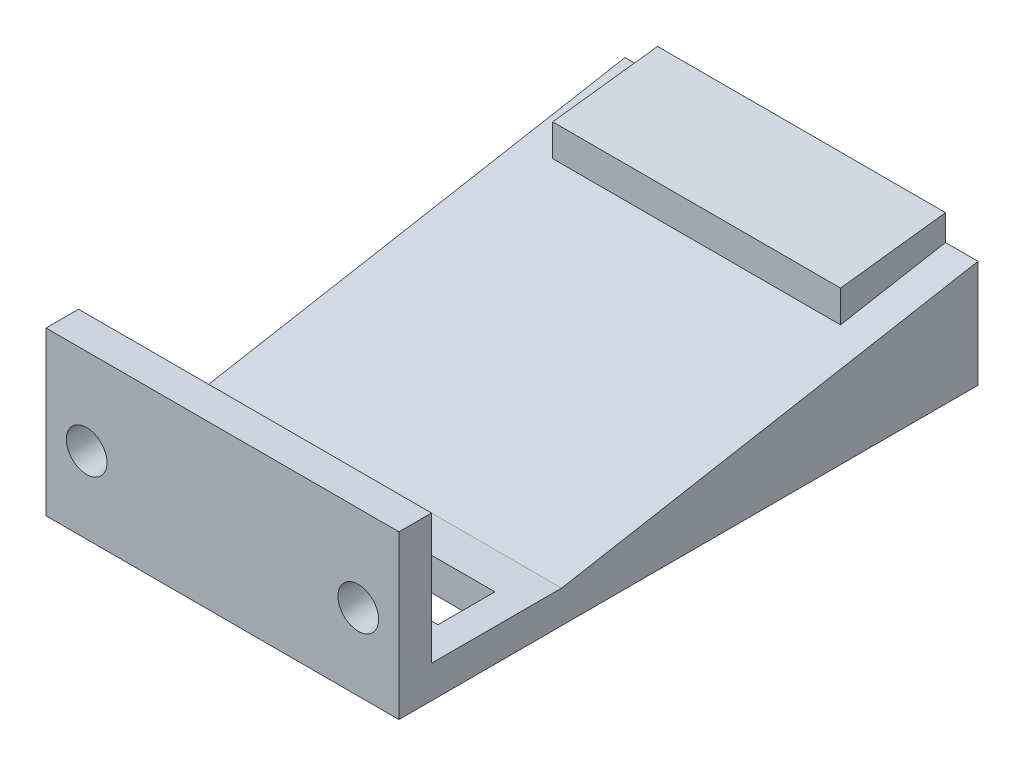
ISO-10303-21;
HEADER;
FILE_DESCRIPTION(('STEP AP214'),'2;1');
FILE_NAME('part.step','',(''),(''),'','','');
FILE_SCHEMA(('AUTOMOTIVE_DESIGN { 1 0 10303 214 1 1 1 1 }'));
ENDSEC;
DATA;
#1=APPLICATION_CONTEXT('core data for automotive mechanical design processes');
#2=APPLICATION_PROTOCOL_DEFINITION('international standard','automotive_design',2000,#1);
#3=PRODUCT_CONTEXT('',#1,'mechanical');
#4=PRODUCT('Part','Part','',(#3));
#5=PRODUCT_RELATED_PRODUCT_CATEGORY('part','',(#4));
#6=PRODUCT_DEFINITION_FORMATION('','',#4);
#7=PRODUCT_DEFINITION_CONTEXT('part definition',#1,'design');
#8=PRODUCT_DEFINITION('design','',#6,#7);
#9=PRODUCT_DEFINITION_SHAPE('','',#8);
#10=(LENGTH_UNIT() NAMED_UNIT(*) SI_UNIT(.MILLI.,.METRE.));
#11=(NAMED_UNIT(*) PLANE_ANGLE_UNIT() SI_UNIT($,.RADIAN.));
#12=(NAMED_UNIT(*) SI_UNIT($,.STERADIAN.) SOLID_ANGLE_UNIT());
#13=UNCERTAINTY_MEASURE_WITH_UNIT(LENGTH_MEASURE(1.E-05),#10,'distance_accuracy_value','');
#14=(GEOMETRIC_REPRESENTATION_CONTEXT(3) GLOBAL_UNCERTAINTY_ASSIGNED_CONTEXT((#13)) GLOBAL_UNIT_ASSIGNED_CONTEXT((#10,
#11,#12)) REPRESENTATION_CONTEXT('',''));
#15=CARTESIAN_POINT('',(0.,0.,0.));
#16=DIRECTION('',(0.,0.,1.));
#17=DIRECTION('',(1.,0.,0.));
#18=AXIS2_PLACEMENT_3D('',#15,#16,#17);
#19=CARTESIAN_POINT('',(10.85,3.,-16.8));
#20=DIRECTION('',(-1.,0.,0.));
#21=DIRECTION('',(0.,0.,1.));
#22=AXIS2_PLACEMENT_3D('',#19,#20,#21);
#23=PLANE('',#22);
#24=DIRECTION('',(0.,0.,1.));
#25=VECTOR('',#24,1.);
#26=CARTESIAN_POINT('',(10.85,1.,-16.8));
#27=LINE('',#26,#25);
#28=CARTESIAN_POINT('',(10.85,1.,-16.8));
#29=VERTEX_POINT('',#28);
#30=CARTESIAN_POINT('',(10.85,1.,18.8));
#31=VERTEX_POINT('',#30);
#32=EDGE_CURVE('E57',#29,#31,#27,.T.);
#33=ORIENTED_EDGE('',*,*,#32,.F.);
#34=DIRECTION('',(0.,-1.,0.));
#35=VECTOR('',#34,1.);
#36=CARTESIAN_POINT('',(10.85,3.,-16.8));
#37=LINE('',#36,#35);
#38=CARTESIAN_POINT('',(10.85,7.6,-16.8));
#39=VERTEX_POINT('',#38);
#40=EDGE_CURVE('E236',#39,#29,#37,.T.);
#41=ORIENTED_EDGE('',*,*,#40,.F.);
#42=DIRECTION('',(0.,-0.176855068818729,0.984236904730321));
#43=VECTOR('',#42,1.);
#44=CARTESIAN_POINT('',(10.85,3.,8.8));
#45=LINE('',#44,#43);
#46=CARTESIAN_POINT('',(10.85,3.,8.8));
#47=VERTEX_POINT('',#46);
#48=EDGE_CURVE('E187',#39,#47,#45,.T.);
#49=ORIENTED_EDGE('',*,*,#48,.T.);
#50=DIRECTION('',(0.,0.,-1.));
#51=VECTOR('',#50,1.);
#52=CARTESIAN_POINT('',(10.85,3.,-16.8));
#53=LINE('',#52,#51);
#54=CARTESIAN_POINT('',(10.85,3.,16.8));
#55=VERTEX_POINT('',#54);
#56=EDGE_CURVE('E221',#55,#47,#53,.T.);
#57=ORIENTED_EDGE('',*,*,#56,.F.);
#58=DIRECTION('',(0.,-1.,0.));
#59=VECTOR('',#58,1.);
#60=CARTESIAN_POINT('',(10.85,11.,16.8));
#61=LINE('',#60,#59);
#62=CARTESIAN_POINT('',(10.85,11.,16.8));
#63=VERTEX_POINT('',#62);
#64=EDGE_CURVE('E173',#63,#55,#61,.T.);
#65=ORIENTED_EDGE('',*,*,#64,.F.);
#66=DIRECTION('',(0.,0.,-1.));
#67=VECTOR('',#66,1.);
#68=CARTESIAN_POINT('',(10.85,11.,16.8));
#69=LINE('',#68,#67);
#70=CARTESIAN_POINT('',(10.85,11.,18.8));
#71=VERTEX_POINT('',#70);
#72=EDGE_CURVE('E298',#71,#63,#69,.T.);
#73=ORIENTED_EDGE('',*,*,#72,.F.);
#74=DIRECTION('',(0.,-1.,0.));
#75=VECTOR('',#74,1.);
#76=CARTESIAN_POINT('',(10.85,11.,18.8));
#77=LINE('',#76,#75);
#78=EDGE_CURVE('E170',#71,#31,#77,.T.);
#79=ORIENTED_EDGE('',*,*,#78,.T.);
#80=EDGE_LOOP('',(#33,#41,#49,#57,#65,#73,#79));
#81=FACE_BOUND('',#80,.T.);
#82=ADVANCED_FACE('F41',(#81),#23,.F.);
#83=CARTESIAN_POINT('',(-10.85,3.,-16.8));
#84=DIRECTION('',(0.,0.,1.));
#85=DIRECTION('',(1.,0.,0.));
#86=AXIS2_PLACEMENT_3D('',#83,#84,#85);
#87=PLANE('',#86);
#88=DIRECTION('',(1.,0.,0.));
#89=VECTOR('',#88,1.);
#90=CARTESIAN_POINT('',(-10.85,1.,-16.8));
#91=LINE('',#90,#89);
#92=CARTESIAN_POINT('',(-10.85,1.,-16.8));
#93=VERTEX_POINT('',#92);
#94=EDGE_CURVE('E165',#93,#29,#91,.T.);
#95=ORIENTED_EDGE('',*,*,#94,.F.);
#96=DIRECTION('',(0.,-1.,0.));
#97=VECTOR('',#96,1.);
#98=CARTESIAN_POINT('',(-10.85,3.,-16.8));
#99=LINE('',#98,#97);
#100=CARTESIAN_POINT('',(-10.85,7.6,-16.8));
#101=VERTEX_POINT('',#100);
#102=EDGE_CURVE('E164',#101,#93,#99,.T.);
#103=ORIENTED_EDGE('',*,*,#102,.F.);
#104=DIRECTION('',(1.,0.,0.));
#105=VECTOR('',#104,1.);
#106=CARTESIAN_POINT('',(-36.8599980776624,7.6,-16.8));
#107=LINE('',#106,#105);
#108=CARTESIAN_POINT('',(-8.85,7.6,-16.8));
#109=VERTEX_POINT('',#108);
#110=EDGE_CURVE('E197',#101,#109,#107,.T.);
#111=ORIENTED_EDGE('',*,*,#110,.T.);
#112=DIRECTION('',(0.,-1.,0.));
#113=VECTOR('',#112,1.);
#114=CARTESIAN_POINT('',(-8.85,9.2,-16.8));
#115=LINE('',#114,#113);
#116=CARTESIAN_POINT('',(-8.85,9.19196041782367,-16.8));
#117=VERTEX_POINT('',#116);
#118=EDGE_CURVE('E183',#117,#109,#115,.T.);
#119=ORIENTED_EDGE('',*,*,#118,.F.);
#120=DIRECTION('',(1.,0.,0.));
#121=VECTOR('',#120,1.);
#122=CARTESIAN_POINT('',(0.,9.19196041782367,-16.8));
#123=LINE('',#122,#121);
#124=CARTESIAN_POINT('',(8.85,9.19196041782367,-16.8));
#125=VERTEX_POINT('',#124);
#126=EDGE_CURVE('E248',#117,#125,#123,.T.);
#127=ORIENTED_EDGE('',*,*,#126,.T.);
#128=DIRECTION('',(0.,-1.,0.));
#129=VECTOR('',#128,1.);
#130=CARTESIAN_POINT('',(8.85,9.2,-16.8));
#131=LINE('',#130,#129);
#132=CARTESIAN_POINT('',(8.85,7.6,-16.8));
#133=VERTEX_POINT('',#132);
#134=EDGE_CURVE('E185',#125,#133,#131,.T.);
#135=ORIENTED_EDGE('',*,*,#134,.T.);
#136=EDGE_CURVE('E194',#133,#39,#107,.T.);
#137=ORIENTED_EDGE('',*,*,#136,.T.);
#138=ORIENTED_EDGE('',*,*,#40,.T.);
#139=EDGE_LOOP('',(#95,#103,#111,#119,#127,#135,#137,#138));
#140=FACE_BOUND('',#139,.T.);
#141=ADVANCED_FACE('F271',(#140),#87,.F.);
#142=CARTESIAN_POINT('',(-10.85,3.,-16.8));
#143=DIRECTION('',(1.,0.,0.));
#144=DIRECTION('',(0.,0.,-1.));
#145=AXIS2_PLACEMENT_3D('',#142,#143,#144);
#146=PLANE('',#145);
#147=DIRECTION('',(0.,0.,-1.));
#148=VECTOR('',#147,1.);
#149=CARTESIAN_POINT('',(-10.85,1.,18.8));
#150=LINE('',#149,#148);
#151=CARTESIAN_POINT('',(-10.85,1.,18.8));
#152=VERTEX_POINT('',#151);
#153=EDGE_CURVE('E149',#152,#93,#150,.T.);
#154=ORIENTED_EDGE('',*,*,#153,.F.);
#155=DIRECTION('',(0.,-1.,0.));
#156=VECTOR('',#155,1.);
#157=CARTESIAN_POINT('',(-10.85,11.,18.8));
#158=LINE('',#157,#156);
#159=CARTESIAN_POINT('',(-10.85,11.,18.8));
#160=VERTEX_POINT('',#159);
#161=EDGE_CURVE('E161',#160,#152,#158,.T.);
#162=ORIENTED_EDGE('',*,*,#161,.F.);
#163=DIRECTION('',(0.,0.,1.));
#164=VECTOR('',#163,1.);
#165=CARTESIAN_POINT('',(-10.85,11.,16.8));
#166=LINE('',#165,#164);
#167=CARTESIAN_POINT('',(-10.85,11.,16.8));
#168=VERTEX_POINT('',#167);
#169=EDGE_CURVE('E303',#168,#160,#166,.T.);
#170=ORIENTED_EDGE('',*,*,#169,.F.);
#171=DIRECTION('',(0.,-1.,0.));
#172=VECTOR('',#171,1.);
#173=CARTESIAN_POINT('',(-10.85,11.,16.8));
#174=LINE('',#173,#172);
#175=CARTESIAN_POINT('',(-10.85,3.,16.8));
#176=VERTEX_POINT('',#175);
#177=EDGE_CURVE('E169',#168,#176,#174,.T.);
#178=ORIENTED_EDGE('',*,*,#177,.T.);
#179=DIRECTION('',(0.,0.,1.));
#180=VECTOR('',#179,1.);
#181=CARTESIAN_POINT('',(-10.85,3.,-16.8));
#182=LINE('',#181,#180);
#183=CARTESIAN_POINT('',(-10.85,3.,8.8));
#184=VERTEX_POINT('',#183);
#185=EDGE_CURVE('E229',#184,#176,#182,.T.);
#186=ORIENTED_EDGE('',*,*,#185,.F.);
#187=DIRECTION('',(0.,0.176855068818729,-0.984236904730321));
#188=VECTOR('',#187,1.);
#189=CARTESIAN_POINT('',(-10.85,3.,8.8));
#190=LINE('',#189,#188);
#191=EDGE_CURVE('E188',#184,#101,#190,.T.);
#192=ORIENTED_EDGE('',*,*,#191,.T.);
#193=ORIENTED_EDGE('',*,*,#102,.T.);
#194=EDGE_LOOP('',(#154,#162,#170,#178,#186,#192,#193));
#195=FACE_BOUND('',#194,.T.);
#196=ADVANCED_FACE('F159',(#195),#146,.F.);
#197=CARTESIAN_POINT('',(-10.85,11.,18.8));
#198=DIRECTION('',(0.,0.,-1.));
#199=DIRECTION('',(-1.,0.,0.));
#200=AXIS2_PLACEMENT_3D('',#197,#198,#199);
#201=PLANE('',#200);
#202=CARTESIAN_POINT('',(8.35,5.7,18.8));
#203=DIRECTION('',(0.,0.,1.));
#204=DIRECTION('',(1.,0.,0.));
#205=AXIS2_PLACEMENT_3D('',#202,#203,#204);
#206=CIRCLE('',#205,1.25);
#207=CARTESIAN_POINT('',(9.6,5.7,18.8));
#208=VERTEX_POINT('',#207);
#209=EDGE_CURVE('E292',#208,#208,#206,.T.);
#210=ORIENTED_EDGE('',*,*,#209,.F.);
#211=EDGE_LOOP('',(#210));
#212=FACE_BOUND('',#211,.T.);
#213=CARTESIAN_POINT('',(-8.35,5.7,18.8));
#214=DIRECTION('',(0.,0.,1.));
#215=DIRECTION('',(1.,0.,0.));
#216=AXIS2_PLACEMENT_3D('',#213,#214,#215);
#217=CIRCLE('',#216,1.25);
#218=CARTESIAN_POINT('',(-7.10000000000001,5.7,18.8));
#219=VERTEX_POINT('',#218);
#220=EDGE_CURVE('E284',#219,#219,#217,.T.);
#221=ORIENTED_EDGE('',*,*,#220,.F.);
#222=EDGE_LOOP('',(#221));
#223=FACE_BOUND('',#222,.T.);
#224=DIRECTION('',(-1.,0.,0.));
#225=VECTOR('',#224,1.);
#226=CARTESIAN_POINT('',(10.85,1.,18.8));
#227=LINE('',#226,#225);
#228=EDGE_CURVE('E145',#31,#152,#227,.T.);
#229=ORIENTED_EDGE('',*,*,#228,.F.);
#230=ORIENTED_EDGE('',*,*,#78,.F.);
#231=DIRECTION('',(1.,0.,0.));
#232=VECTOR('',#231,1.);
#233=CARTESIAN_POINT('',(-10.85,11.,18.8));
#234=LINE('',#233,#232);
#235=EDGE_CURVE('E168',#160,#71,#234,.T.);
#236=ORIENTED_EDGE('',*,*,#235,.F.);
#237=ORIENTED_EDGE('',*,*,#161,.T.);
#238=EDGE_LOOP('',(#229,#230,#236,#237));
#239=FACE_BOUND('',#238,.T.);
#240=ADVANCED_FACE('F167',(#212,#223,#239),#201,.F.);
#241=CARTESIAN_POINT('',(-36.8599980776624,3.,8.80000000000001));
#242=DIRECTION('',(0.,0.984236904730321,0.176855068818729));
#243=DIRECTION('',(0.,-0.176855068818729,0.984236904730321));
#244=AXIS2_PLACEMENT_3D('',#241,#242,#243);
#245=PLANE('',#244);
#246=ORIENTED_EDGE('',*,*,#136,.F.);
#247=DIRECTION('',(0.,-0.176855068818729,0.984236904730321));
#248=VECTOR('',#247,1.);
#249=CARTESIAN_POINT('',(8.85,3.,8.8));
#250=LINE('',#249,#248);
#251=CARTESIAN_POINT('',(8.85,6.441015625,-10.35));
#252=VERTEX_POINT('',#251);
#253=EDGE_CURVE('E245',#133,#252,#250,.T.);
#254=ORIENTED_EDGE('',*,*,#253,.T.);
#255=DIRECTION('',(-1.,0.,0.));
#256=VECTOR('',#255,1.);
#257=CARTESIAN_POINT('',(-36.8599980776624,6.441015625,-10.35));
#258=LINE('',#257,#256);
#259=CARTESIAN_POINT('',(-8.85,6.441015625,-10.35));
#260=VERTEX_POINT('',#259);
#261=EDGE_CURVE('E239',#252,#260,#258,.T.);
#262=ORIENTED_EDGE('',*,*,#261,.T.);
#263=DIRECTION('',(0.,0.176855068818729,-0.984236904730321));
#264=VECTOR('',#263,1.);
#265=CARTESIAN_POINT('',(-8.85,3.,8.80000000000001));
#266=LINE('',#265,#264);
#267=EDGE_CURVE('E242',#260,#109,#266,.T.);
#268=ORIENTED_EDGE('',*,*,#267,.T.);
#269=ORIENTED_EDGE('',*,*,#110,.F.);
#270=ORIENTED_EDGE('',*,*,#191,.F.);
#271=DIRECTION('',(1.,0.,0.));
#272=VECTOR('',#271,1.);
#273=CARTESIAN_POINT('',(-36.8599980776624,3.,8.80000000000001));
#274=LINE('',#273,#272);
#275=EDGE_CURVE('E191',#184,#47,#274,.T.);
#276=ORIENTED_EDGE('',*,*,#275,.T.);
#277=ORIENTED_EDGE('',*,*,#48,.F.);
#278=EDGE_LOOP('',(#246,#254,#262,#268,#269,#270,#276,#277));
#279=FACE_BOUND('',#278,.T.);
#280=ADVANCED_FACE('F264',(#279),#245,.T.);
#281=CARTESIAN_POINT('',(0.,3.,0.));
#282=DIRECTION('',(0.,1.,0.));
#283=DIRECTION('',(0.,0.,1.));
#284=AXIS2_PLACEMENT_3D('',#281,#282,#283);
#285=PLANE('',#284);
#286=ORIENTED_EDGE('',*,*,#275,.F.);
#287=ORIENTED_EDGE('',*,*,#185,.T.);
#288=DIRECTION('',(1.,0.,0.));
#289=VECTOR('',#288,1.);
#290=CARTESIAN_POINT('',(-10.85,3.,16.8));
#291=LINE('',#290,#289);
#292=EDGE_CURVE('E232',#176,#55,#291,.T.);
#293=ORIENTED_EDGE('',*,*,#292,.T.);
#294=ORIENTED_EDGE('',*,*,#56,.T.);
#295=EDGE_LOOP('',(#286,#287,#293,#294));
#296=FACE_BOUND('',#295,.T.);
#297=DIRECTION('',(0.,0.,-1.));
#298=VECTOR('',#297,1.);
#299=CARTESIAN_POINT('',(9.,3.,11.05));
#300=LINE('',#299,#298);
#301=CARTESIAN_POINT('',(9.,3.,14.55));
#302=VERTEX_POINT('',#301);
#303=CARTESIAN_POINT('',(9.,3.,11.05));
#304=VERTEX_POINT('',#303);
#305=EDGE_CURVE('E190',#302,#304,#300,.T.);
#306=ORIENTED_EDGE('',*,*,#305,.F.);
#307=DIRECTION('',(1.,0.,0.));
#308=VECTOR('',#307,1.);
#309=CARTESIAN_POINT('',(-9.,3.,14.55));
#310=LINE('',#309,#308);
#311=CARTESIAN_POINT('',(-9.,3.,14.55));
#312=VERTEX_POINT('',#311);
#313=EDGE_CURVE('E203',#312,#302,#310,.T.);
#314=ORIENTED_EDGE('',*,*,#313,.F.);
#315=DIRECTION('',(0.,0.,1.));
#316=VECTOR('',#315,1.);
#317=CARTESIAN_POINT('',(-9.,3.,11.05));
#318=LINE('',#317,#316);
#319=CARTESIAN_POINT('',(-9.,3.,11.05));
#320=VERTEX_POINT('',#319);
#321=EDGE_CURVE('E214',#320,#312,#318,.T.);
#322=ORIENTED_EDGE('',*,*,#321,.F.);
#323=DIRECTION('',(-1.,0.,0.));
#324=VECTOR('',#323,1.);
#325=CARTESIAN_POINT('',(-9.,3.,11.05));
#326=LINE('',#325,#324);
#327=EDGE_CURVE('E211',#304,#320,#326,.T.);
#328=ORIENTED_EDGE('',*,*,#327,.F.);
#329=EDGE_LOOP('',(#306,#314,#322,#328));
#330=FACE_BOUND('',#329,.T.);
#331=ADVANCED_FACE('F276',(#296,#330),#285,.T.);
#332=CARTESIAN_POINT('',(9.,1.,11.05));
#333=DIRECTION('',(1.,0.,0.));
#334=DIRECTION('',(0.,0.,-1.));
#335=AXIS2_PLACEMENT_3D('',#332,#333,#334);
#336=PLANE('',#335);
#337=ORIENTED_EDGE('',*,*,#305,.T.);
#338=DIRECTION('',(0.,1.,0.));
#339=VECTOR('',#338,1.);
#340=CARTESIAN_POINT('',(9.,1.,11.05));
#341=LINE('',#340,#339);
#342=CARTESIAN_POINT('',(9.,1.,11.05));
#343=VERTEX_POINT('',#342);
#344=EDGE_CURVE('E209',#343,#304,#341,.T.);
#345=ORIENTED_EDGE('',*,*,#344,.F.);
#346=DIRECTION('',(0.,0.,-1.));
#347=VECTOR('',#346,1.);
#348=CARTESIAN_POINT('',(9.,1.,11.05));
#349=LINE('',#348,#347);
#350=CARTESIAN_POINT('',(9.,1.,14.55));
#351=VERTEX_POINT('',#350);
#352=EDGE_CURVE('E200',#351,#343,#349,.T.);
#353=ORIENTED_EDGE('',*,*,#352,.F.);
#354=DIRECTION('',(0.,1.,0.));
#355=VECTOR('',#354,1.);
#356=CARTESIAN_POINT('',(9.,1.,14.55));
#357=LINE('',#356,#355);
#358=EDGE_CURVE('E219',#351,#302,#357,.T.);
#359=ORIENTED_EDGE('',*,*,#358,.T.);
#360=EDGE_LOOP('',(#337,#345,#353,#359));
#361=FACE_BOUND('',#360,.T.);
#362=ADVANCED_FACE('F332',(#361),#336,.F.);
#363=CARTESIAN_POINT('',(-9.,1.,14.55));
#364=DIRECTION('',(0.,0.,1.));
#365=DIRECTION('',(1.,0.,0.));
#366=AXIS2_PLACEMENT_3D('',#363,#364,#365);
#367=PLANE('',#366);
#368=ORIENTED_EDGE('',*,*,#313,.T.);
#369=ORIENTED_EDGE('',*,*,#358,.F.);
#370=DIRECTION('',(1.,0.,0.));
#371=VECTOR('',#370,1.);
#372=CARTESIAN_POINT('',(-9.,1.,14.55));
#373=LINE('',#372,#371);
#374=CARTESIAN_POINT('',(-9.,1.,14.55));
#375=VERTEX_POINT('',#374);
#376=EDGE_CURVE('E207',#375,#351,#373,.T.);
#377=ORIENTED_EDGE('',*,*,#376,.F.);
#378=DIRECTION('',(0.,1.,0.));
#379=VECTOR('',#378,1.);
#380=CARTESIAN_POINT('',(-9.,1.,14.55));
#381=LINE('',#380,#379);
#382=EDGE_CURVE('E222',#375,#312,#381,.T.);
#383=ORIENTED_EDGE('',*,*,#382,.T.);
#384=EDGE_LOOP('',(#368,#369,#377,#383));
#385=FACE_BOUND('',#384,.T.);
#386=ADVANCED_FACE('F335',(#385),#367,.F.);
#387=CARTESIAN_POINT('',(-9.,1.,11.05));
#388=DIRECTION('',(-1.,0.,0.));
#389=DIRECTION('',(0.,0.,1.));
#390=AXIS2_PLACEMENT_3D('',#387,#388,#389);
#391=PLANE('',#390);
#392=ORIENTED_EDGE('',*,*,#321,.T.);
#393=ORIENTED_EDGE('',*,*,#382,.F.);
#394=DIRECTION('',(0.,0.,1.));
#395=VECTOR('',#394,1.);
#396=CARTESIAN_POINT('',(-9.,1.,11.05));
#397=LINE('',#396,#395);
#398=CARTESIAN_POINT('',(-9.,1.,11.05));
#399=VERTEX_POINT('',#398);
#400=EDGE_CURVE('E205',#399,#375,#397,.T.);
#401=ORIENTED_EDGE('',*,*,#400,.F.);
#402=DIRECTION('',(0.,1.,0.));
#403=VECTOR('',#402,1.);
#404=CARTESIAN_POINT('',(-9.,1.,11.05));
#405=LINE('',#404,#403);
#406=EDGE_CURVE('E224',#399,#320,#405,.T.);
#407=ORIENTED_EDGE('',*,*,#406,.T.);
#408=EDGE_LOOP('',(#392,#393,#401,#407));
#409=FACE_BOUND('',#408,.T.);
#410=ADVANCED_FACE('F340',(#409),#391,.F.);
#411=CARTESIAN_POINT('',(-9.,1.,11.05));
#412=DIRECTION('',(0.,0.,-1.));
#413=DIRECTION('',(-1.,0.,0.));
#414=AXIS2_PLACEMENT_3D('',#411,#412,#413);
#415=PLANE('',#414);
#416=ORIENTED_EDGE('',*,*,#327,.T.);
#417=ORIENTED_EDGE('',*,*,#406,.F.);
#418=DIRECTION('',(-1.,0.,0.));
#419=VECTOR('',#418,1.);
#420=CARTESIAN_POINT('',(-9.,1.,11.05));
#421=LINE('',#420,#419);
#422=EDGE_CURVE('E202',#343,#399,#421,.T.);
#423=ORIENTED_EDGE('',*,*,#422,.F.);
#424=ORIENTED_EDGE('',*,*,#344,.T.);
#425=EDGE_LOOP('',(#416,#417,#423,#424));
#426=FACE_BOUND('',#425,.T.);
#427=ADVANCED_FACE('F337',(#426),#415,.F.);
#428=CARTESIAN_POINT('',(8.85,9.2,-16.8));
#429=DIRECTION('',(-1.,0.,0.));
#430=DIRECTION('',(0.,0.,1.));
#431=AXIS2_PLACEMENT_3D('',#428,#429,#430);
#432=PLANE('',#431);
#433=ORIENTED_EDGE('',*,*,#134,.F.);
#434=DIRECTION('',(0.,-0.121869343405145,0.992546151641323));
#435=VECTOR('',#434,1.);
#436=CARTESIAN_POINT('',(8.85,9.2,-16.8654771423802));
#437=LINE('',#436,#435);
#438=CARTESIAN_POINT('',(8.85,8.39999999999995,-10.35));
#439=VERTEX_POINT('',#438);
#440=EDGE_CURVE('E250',#125,#439,#437,.T.);
#441=ORIENTED_EDGE('',*,*,#440,.T.);
#442=DIRECTION('',(0.,-1.,0.));
#443=VECTOR('',#442,1.);
#444=CARTESIAN_POINT('',(8.85,9.2,-10.35));
#445=LINE('',#444,#443);
#446=EDGE_CURVE('E179',#439,#252,#445,.T.);
#447=ORIENTED_EDGE('',*,*,#446,.T.);
#448=ORIENTED_EDGE('',*,*,#253,.F.);
#449=EDGE_LOOP('',(#433,#441,#447,#448));
#450=FACE_BOUND('',#449,.T.);
#451=ADVANCED_FACE('F269',(#450),#432,.F.);
#452=CARTESIAN_POINT('',(-8.85,9.2,-16.8));
#453=DIRECTION('',(1.,0.,0.));
#454=DIRECTION('',(0.,0.,-1.));
#455=AXIS2_PLACEMENT_3D('',#452,#453,#454);
#456=PLANE('',#455);
#457=DIRECTION('',(0.,-1.,0.));
#458=VECTOR('',#457,1.);
#459=CARTESIAN_POINT('',(-8.85,9.2,-10.35));
#460=LINE('',#459,#458);
#461=CARTESIAN_POINT('',(-8.85,8.39999999999995,-10.35));
#462=VERTEX_POINT('',#461);
#463=EDGE_CURVE('E181',#462,#260,#460,.T.);
#464=ORIENTED_EDGE('',*,*,#463,.F.);
#465=DIRECTION('',(0.,0.121869343405145,-0.992546151641323));
#466=VECTOR('',#465,1.);
#467=CARTESIAN_POINT('',(-8.85,9.2,-16.8654771423802));
#468=LINE('',#467,#466);
#469=EDGE_CURVE('E11',#462,#117,#468,.T.);
#470=ORIENTED_EDGE('',*,*,#469,.T.);
#471=ORIENTED_EDGE('',*,*,#118,.T.);
#472=ORIENTED_EDGE('',*,*,#267,.F.);
#473=EDGE_LOOP('',(#464,#470,#471,#472));
#474=FACE_BOUND('',#473,.T.);
#475=ADVANCED_FACE('F259',(#474),#456,.F.);
#476=CARTESIAN_POINT('',(-8.85,9.2,-10.35));
#477=DIRECTION('',(0.,0.,-1.));
#478=DIRECTION('',(-1.,0.,0.));
#479=AXIS2_PLACEMENT_3D('',#476,#477,#478);
#480=PLANE('',#479);
#481=ORIENTED_EDGE('',*,*,#446,.F.);
#482=DIRECTION('',(-1.,0.,0.));
#483=VECTOR('',#482,1.);
#484=CARTESIAN_POINT('',(-8.85,8.39999999999995,-10.35));
#485=LINE('',#484,#483);
#486=EDGE_CURVE('E50',#439,#462,#485,.T.);
#487=ORIENTED_EDGE('',*,*,#486,.T.);
#488=ORIENTED_EDGE('',*,*,#463,.T.);
#489=ORIENTED_EDGE('',*,*,#261,.F.);
#490=EDGE_LOOP('',(#481,#487,#488,#489));
#491=FACE_BOUND('',#490,.T.);
#492=ADVANCED_FACE('F254',(#491),#480,.F.);
#493=CARTESIAN_POINT('',(-10.85,11.,16.8));
#494=DIRECTION('',(0.,0.,1.));
#495=DIRECTION('',(1.,0.,0.));
#496=AXIS2_PLACEMENT_3D('',#493,#494,#495);
#497=PLANE('',#496);
#498=CARTESIAN_POINT('',(-8.35,5.7,16.8));
#499=DIRECTION('',(0.,0.,1.));
#500=DIRECTION('',(1.,0.,0.));
#501=AXIS2_PLACEMENT_3D('',#498,#499,#500);
#502=CIRCLE('',#501,1.25);
#503=CARTESIAN_POINT('',(-7.10000000000001,5.7,16.8));
#504=VERTEX_POINT('',#503);
#505=EDGE_CURVE('E289',#504,#504,#502,.T.);
#506=ORIENTED_EDGE('',*,*,#505,.T.);
#507=EDGE_LOOP('',(#506));
#508=FACE_BOUND('',#507,.T.);
#509=CARTESIAN_POINT('',(8.35,5.7,16.8));
#510=DIRECTION('',(0.,0.,1.));
#511=DIRECTION('',(1.,0.,0.));
#512=AXIS2_PLACEMENT_3D('',#509,#510,#511);
#513=CIRCLE('',#512,1.25);
#514=CARTESIAN_POINT('',(9.6,5.7,16.8));
#515=VERTEX_POINT('',#514);
#516=EDGE_CURVE('E295',#515,#515,#513,.T.);
#517=ORIENTED_EDGE('',*,*,#516,.T.);
#518=EDGE_LOOP('',(#517));
#519=FACE_BOUND('',#518,.T.);
#520=ORIENTED_EDGE('',*,*,#292,.F.);
#521=ORIENTED_EDGE('',*,*,#177,.F.);
#522=DIRECTION('',(-1.,0.,0.));
#523=VECTOR('',#522,1.);
#524=CARTESIAN_POINT('',(-10.85,11.,16.8));
#525=LINE('',#524,#523);
#526=EDGE_CURVE('E301',#63,#168,#525,.T.);
#527=ORIENTED_EDGE('',*,*,#526,.F.);
#528=ORIENTED_EDGE('',*,*,#64,.T.);
#529=EDGE_LOOP('',(#520,#521,#527,#528));
#530=FACE_BOUND('',#529,.T.);
#531=ADVANCED_FACE('F307',(#508,#519,#530),#497,.F.);
#532=CARTESIAN_POINT('',(0.,11.,0.));
#533=DIRECTION('',(0.,1.,0.));
#534=DIRECTION('',(0.,0.,1.));
#535=AXIS2_PLACEMENT_3D('',#532,#533,#534);
#536=PLANE('',#535);
#537=ORIENTED_EDGE('',*,*,#72,.T.);
#538=ORIENTED_EDGE('',*,*,#526,.T.);
#539=ORIENTED_EDGE('',*,*,#169,.T.);
#540=ORIENTED_EDGE('',*,*,#235,.T.);
#541=EDGE_LOOP('',(#537,#538,#539,#540));
#542=FACE_BOUND('',#541,.T.);
#543=ADVANCED_FACE('F305',(#542),#536,.T.);
#544=CARTESIAN_POINT('',(8.35,5.7,18.8));
#545=DIRECTION('',(0.,0.,1.));
#546=DIRECTION('',(1.,0.,0.));
#547=AXIS2_PLACEMENT_3D('',#544,#545,#546);
#548=CYLINDRICAL_SURFACE('',#547,1.25);
#549=ORIENTED_EDGE('',*,*,#209,.T.);
#550=EDGE_LOOP('',(#549));
#551=FACE_BOUND('',#550,.T.);
#552=ORIENTED_EDGE('',*,*,#516,.F.);
#553=EDGE_LOOP('',(#552));
#554=FACE_BOUND('',#553,.T.);
#555=ADVANCED_FACE('F315',(#551,#554),#548,.F.);
#556=CARTESIAN_POINT('',(-8.35,5.7,18.8));
#557=DIRECTION('',(0.,0.,1.));
#558=DIRECTION('',(1.,0.,0.));
#559=AXIS2_PLACEMENT_3D('',#556,#557,#558);
#560=CYLINDRICAL_SURFACE('',#559,1.25);
#561=ORIENTED_EDGE('',*,*,#220,.T.);
#562=EDGE_LOOP('',(#561));
#563=FACE_BOUND('',#562,.T.);
#564=ORIENTED_EDGE('',*,*,#505,.F.);
#565=EDGE_LOOP('',(#564));
#566=FACE_BOUND('',#565,.T.);
#567=ADVANCED_FACE('F368',(#563,#566),#560,.F.);
#568=CARTESIAN_POINT('',(0.,9.2,-16.8654771423802));
#569=DIRECTION('',(0.,0.992546151641322,0.121869343405145));
#570=DIRECTION('',(-1.,0.,0.));
#571=AXIS2_PLACEMENT_3D('',#568,#569,#570);
#572=PLANE('',#571);
#573=ORIENTED_EDGE('',*,*,#469,.F.);
#574=ORIENTED_EDGE('',*,*,#486,.F.);
#575=ORIENTED_EDGE('',*,*,#440,.F.);
#576=ORIENTED_EDGE('',*,*,#126,.F.);
#577=EDGE_LOOP('',(#573,#574,#575,#576));
#578=FACE_BOUND('',#577,.T.);
#579=ADVANCED_FACE('F44',(#578),#572,.T.);
#580=CARTESIAN_POINT('',(0.,1.,0.));
#581=DIRECTION('',(0.,-1.,0.));
#582=DIRECTION('',(0.,0.,-1.));
#583=AXIS2_PLACEMENT_3D('',#580,#581,#582);
#584=PLANE('',#583);
#585=ORIENTED_EDGE('',*,*,#228,.T.);
#586=ORIENTED_EDGE('',*,*,#153,.T.);
#587=ORIENTED_EDGE('',*,*,#94,.T.);
#588=ORIENTED_EDGE('',*,*,#32,.T.);
#589=EDGE_LOOP('',(#585,#586,#587,#588));
#590=FACE_BOUND('',#589,.T.);
#591=ORIENTED_EDGE('',*,*,#352,.T.);
#592=ORIENTED_EDGE('',*,*,#422,.T.);
#593=ORIENTED_EDGE('',*,*,#400,.T.);
#594=ORIENTED_EDGE('',*,*,#376,.T.);
#595=EDGE_LOOP('',(#591,#592,#593,#594));
#596=FACE_BOUND('',#595,.T.);
#597=ADVANCED_FACE('F147',(#590,#596),#584,.T.);
#598=CLOSED_SHELL('',(#82,#141,#196,#240,#280,#331,#362,#386,#410,#427,#451,#475,#492,#531,#543,
#555,#567,#579,#597));
#599=MANIFOLD_SOLID_BREP('B2',#598);
#600=ADVANCED_BREP_SHAPE_REPRESENTATION('',(#18,#599),#14);
#601=SHAPE_DEFINITION_REPRESENTATION(#9,#600);
ENDSEC;
END-ISO-10303-21;
